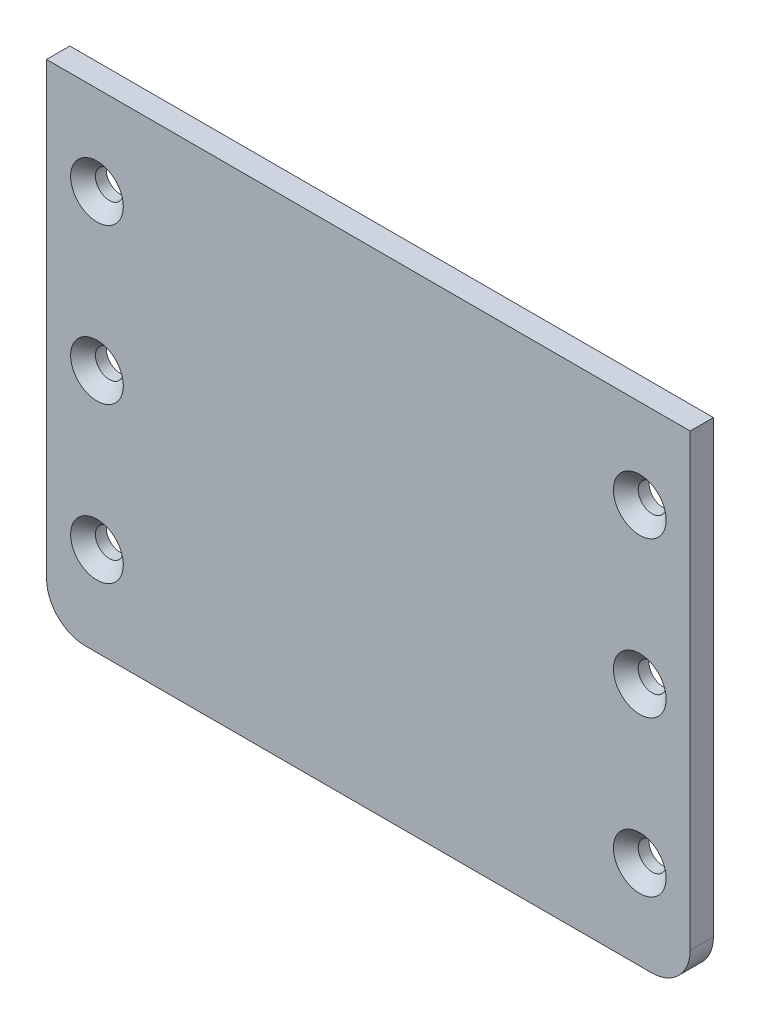
ISO-10303-21;
HEADER;
FILE_DESCRIPTION(('STEP AP214'),'2;1');
FILE_NAME('part.step','',(''),(''),'','','');
FILE_SCHEMA(('AUTOMOTIVE_DESIGN { 1 0 10303 214 1 1 1 1 }'));
ENDSEC;
DATA;
#1=APPLICATION_CONTEXT('core data for automotive mechanical design processes');
#2=APPLICATION_PROTOCOL_DEFINITION('international standard','automotive_design',2000,#1);
#3=PRODUCT_CONTEXT('',#1,'mechanical');
#4=PRODUCT('Part','Part','',(#3));
#5=PRODUCT_RELATED_PRODUCT_CATEGORY('part','',(#4));
#6=PRODUCT_DEFINITION_FORMATION('','',#4);
#7=PRODUCT_DEFINITION_CONTEXT('part definition',#1,'design');
#8=PRODUCT_DEFINITION('design','',#6,#7);
#9=PRODUCT_DEFINITION_SHAPE('','',#8);
#10=(LENGTH_UNIT() NAMED_UNIT(*) SI_UNIT(.MILLI.,.METRE.));
#11=(NAMED_UNIT(*) PLANE_ANGLE_UNIT() SI_UNIT($,.RADIAN.));
#12=(NAMED_UNIT(*) SI_UNIT($,.STERADIAN.) SOLID_ANGLE_UNIT());
#13=UNCERTAINTY_MEASURE_WITH_UNIT(LENGTH_MEASURE(1.E-05),#10,'distance_accuracy_value','');
#14=(GEOMETRIC_REPRESENTATION_CONTEXT(3) GLOBAL_UNCERTAINTY_ASSIGNED_CONTEXT((#13)) GLOBAL_UNIT_ASSIGNED_CONTEXT((#10,
#11,#12)) REPRESENTATION_CONTEXT('',''));
#15=CARTESIAN_POINT('',(0.,0.,0.));
#16=DIRECTION('',(0.,0.,1.));
#17=DIRECTION('',(1.,0.,0.));
#18=AXIS2_PLACEMENT_3D('',#15,#16,#17);
#19=CARTESIAN_POINT('',(-72.,0.,3.));
#20=DIRECTION('',(-1.,0.,0.));
#21=DIRECTION('',(0.,0.,1.));
#22=AXIS2_PLACEMENT_3D('',#19,#20,#21);
#23=PLANE('',#22);
#24=DIRECTION('',(0.,1.,0.));
#25=VECTOR('',#24,1.);
#26=CARTESIAN_POINT('',(-72.,0.,0.));
#27=LINE('',#26,#25);
#28=CARTESIAN_POINT('',(-72.,4.99999999999999,0.));
#29=VERTEX_POINT('',#28);
#30=CARTESIAN_POINT('',(-72.,63.,0.));
#31=VERTEX_POINT('',#30);
#32=EDGE_CURVE('E122',#29,#31,#27,.T.);
#33=ORIENTED_EDGE('',*,*,#32,.F.);
#34=DIRECTION('',(0.,0.,-1.));
#35=VECTOR('',#34,1.);
#36=CARTESIAN_POINT('',(-72.,4.99999999999999,3.));
#37=LINE('',#36,#35);
#38=CARTESIAN_POINT('',(-72.,4.99999999999999,3.));
#39=VERTEX_POINT('',#38);
#40=EDGE_CURVE('E65',#29,#39,#37,.F.);
#41=ORIENTED_EDGE('',*,*,#40,.T.);
#42=DIRECTION('',(0.,1.,0.));
#43=VECTOR('',#42,1.);
#44=CARTESIAN_POINT('',(-72.,0.,3.));
#45=LINE('',#44,#43);
#46=CARTESIAN_POINT('',(-72.,63.,3.));
#47=VERTEX_POINT('',#46);
#48=EDGE_CURVE('E130',#39,#47,#45,.T.);
#49=ORIENTED_EDGE('',*,*,#48,.T.);
#50=DIRECTION('',(0.,0.,-1.));
#51=VECTOR('',#50,1.);
#52=CARTESIAN_POINT('',(-72.,63.,3.));
#53=LINE('',#52,#51);
#54=EDGE_CURVE('E114',#47,#31,#53,.T.);
#55=ORIENTED_EDGE('',*,*,#54,.T.);
#56=EDGE_LOOP('',(#33,#41,#49,#55));
#57=FACE_BOUND('',#56,.T.);
#58=ADVANCED_FACE('F42',(#57),#23,.T.);
#59=CARTESIAN_POINT('',(0.,0.,3.));
#60=DIRECTION('',(0.,-1.,0.));
#61=DIRECTION('',(1.,0.,0.));
#62=AXIS2_PLACEMENT_3D('',#59,#60,#61);
#63=PLANE('',#62);
#64=DIRECTION('',(-1.,0.,0.));
#65=VECTOR('',#64,1.);
#66=CARTESIAN_POINT('',(0.,0.,3.));
#67=LINE('',#66,#65);
#68=CARTESIAN_POINT('',(6.,0.,3.));
#69=VERTEX_POINT('',#68);
#70=CARTESIAN_POINT('',(-67.,0.,3.));
#71=VERTEX_POINT('',#70);
#72=EDGE_CURVE('E103',#69,#71,#67,.T.);
#73=ORIENTED_EDGE('',*,*,#72,.T.);
#74=DIRECTION('',(0.,0.,-1.));
#75=VECTOR('',#74,1.);
#76=CARTESIAN_POINT('',(-67.,0.,3.));
#77=LINE('',#76,#75);
#78=CARTESIAN_POINT('',(-67.,0.,0.));
#79=VERTEX_POINT('',#78);
#80=EDGE_CURVE('E161',#71,#79,#77,.T.);
#81=ORIENTED_EDGE('',*,*,#80,.T.);
#82=DIRECTION('',(-1.,0.,0.));
#83=VECTOR('',#82,1.);
#84=CARTESIAN_POINT('',(0.,0.,0.));
#85=LINE('',#84,#83);
#86=CARTESIAN_POINT('',(6.,0.,0.));
#87=VERTEX_POINT('',#86);
#88=EDGE_CURVE('E124',#87,#79,#85,.T.);
#89=ORIENTED_EDGE('',*,*,#88,.F.);
#90=DIRECTION('',(0.,0.,-1.));
#91=VECTOR('',#90,1.);
#92=CARTESIAN_POINT('',(6.,0.,3.));
#93=LINE('',#92,#91);
#94=EDGE_CURVE('E113',#87,#69,#93,.F.);
#95=ORIENTED_EDGE('',*,*,#94,.T.);
#96=EDGE_LOOP('',(#73,#81,#89,#95));
#97=FACE_BOUND('',#96,.T.);
#98=ADVANCED_FACE('F174',(#97),#63,.T.);
#99=CARTESIAN_POINT('',(11.,0.,3.));
#100=DIRECTION('',(-1.,0.,0.));
#101=DIRECTION('',(0.,-1.,0.));
#102=AXIS2_PLACEMENT_3D('',#99,#100,#101);
#103=PLANE('',#102);
#104=DIRECTION('',(0.,1.,0.));
#105=VECTOR('',#104,1.);
#106=CARTESIAN_POINT('',(11.,0.,3.));
#107=LINE('',#106,#105);
#108=CARTESIAN_POINT('',(11.,5.,3.));
#109=VERTEX_POINT('',#108);
#110=CARTESIAN_POINT('',(11.,63.,3.));
#111=VERTEX_POINT('',#110);
#112=EDGE_CURVE('E95',#109,#111,#107,.T.);
#113=ORIENTED_EDGE('',*,*,#112,.F.);
#114=DIRECTION('',(0.,0.,-1.));
#115=VECTOR('',#114,1.);
#116=CARTESIAN_POINT('',(11.,5.,0.));
#117=LINE('',#116,#115);
#118=CARTESIAN_POINT('',(11.,5.,0.));
#119=VERTEX_POINT('',#118);
#120=EDGE_CURVE('E11',#109,#119,#117,.T.);
#121=ORIENTED_EDGE('',*,*,#120,.T.);
#122=DIRECTION('',(0.,1.,0.));
#123=VECTOR('',#122,1.);
#124=CARTESIAN_POINT('',(11.,0.,0.));
#125=LINE('',#124,#123);
#126=CARTESIAN_POINT('',(11.,63.,0.));
#127=VERTEX_POINT('',#126);
#128=EDGE_CURVE('E109',#119,#127,#125,.T.);
#129=ORIENTED_EDGE('',*,*,#128,.T.);
#130=DIRECTION('',(0.,0.,-1.));
#131=VECTOR('',#130,1.);
#132=CARTESIAN_POINT('',(11.,63.,3.));
#133=LINE('',#132,#131);
#134=EDGE_CURVE('E106',#111,#127,#133,.T.);
#135=ORIENTED_EDGE('',*,*,#134,.F.);
#136=EDGE_LOOP('',(#113,#121,#129,#135));
#137=FACE_BOUND('',#136,.T.);
#138=ADVANCED_FACE('F107',(#137),#103,.F.);
#139=CARTESIAN_POINT('',(0.,63.,3.));
#140=DIRECTION('',(0.,-1.,0.));
#141=DIRECTION('',(0.,0.,-1.));
#142=AXIS2_PLACEMENT_3D('',#139,#140,#141);
#143=PLANE('',#142);
#144=DIRECTION('',(-1.,0.,0.));
#145=VECTOR('',#144,1.);
#146=CARTESIAN_POINT('',(0.,63.,0.));
#147=LINE('',#146,#145);
#148=EDGE_CURVE('E129',#127,#31,#147,.T.);
#149=ORIENTED_EDGE('',*,*,#148,.T.);
#150=ORIENTED_EDGE('',*,*,#54,.F.);
#151=DIRECTION('',(-1.,0.,0.));
#152=VECTOR('',#151,1.);
#153=CARTESIAN_POINT('',(0.,63.,3.));
#154=LINE('',#153,#152);
#155=EDGE_CURVE('E99',#111,#47,#154,.T.);
#156=ORIENTED_EDGE('',*,*,#155,.F.);
#157=ORIENTED_EDGE('',*,*,#134,.T.);
#158=EDGE_LOOP('',(#149,#150,#156,#157));
#159=FACE_BOUND('',#158,.T.);
#160=ADVANCED_FACE('F116',(#159),#143,.F.);
#161=CARTESIAN_POINT('',(0.,0.,3.));
#162=DIRECTION('',(0.,0.,1.));
#163=DIRECTION('',(1.,0.,0.));
#164=AXIS2_PLACEMENT_3D('',#161,#162,#163);
#165=PLANE('',#164);
#166=CARTESIAN_POINT('',(-65.5,31.5,3.));
#167=DIRECTION('',(0.,0.,1.));
#168=DIRECTION('',(1.,0.,0.));
#169=AXIS2_PLACEMENT_3D('',#166,#167,#168);
#170=CIRCLE('',#169,3.4);
#171=CARTESIAN_POINT('',(-62.1,31.5,3.));
#172=VERTEX_POINT('',#171);
#173=EDGE_CURVE('E256',#172,#172,#170,.T.);
#174=ORIENTED_EDGE('',*,*,#173,.F.);
#175=EDGE_LOOP('',(#174));
#176=FACE_BOUND('',#175,.T.);
#177=CARTESIAN_POINT('',(-65.5,51.5,3.));
#178=DIRECTION('',(0.,0.,1.));
#179=DIRECTION('',(1.,0.,0.));
#180=AXIS2_PLACEMENT_3D('',#177,#178,#179);
#181=CIRCLE('',#180,3.4);
#182=CARTESIAN_POINT('',(-62.1,51.5,3.));
#183=VERTEX_POINT('',#182);
#184=EDGE_CURVE('E158',#183,#183,#181,.T.);
#185=ORIENTED_EDGE('',*,*,#184,.F.);
#186=EDGE_LOOP('',(#185));
#187=FACE_BOUND('',#186,.T.);
#188=CARTESIAN_POINT('',(-65.5,11.5,3.));
#189=DIRECTION('',(0.,0.,1.));
#190=DIRECTION('',(1.,0.,0.));
#191=AXIS2_PLACEMENT_3D('',#188,#189,#190);
#192=CIRCLE('',#191,3.4);
#193=CARTESIAN_POINT('',(-62.1,11.5,3.));
#194=VERTEX_POINT('',#193);
#195=EDGE_CURVE('E153',#194,#194,#192,.T.);
#196=ORIENTED_EDGE('',*,*,#195,.F.);
#197=EDGE_LOOP('',(#196));
#198=FACE_BOUND('',#197,.T.);
#199=CARTESIAN_POINT('',(4.5,11.5,3.));
#200=DIRECTION('',(0.,0.,1.));
#201=DIRECTION('',(1.,0.,0.));
#202=AXIS2_PLACEMENT_3D('',#199,#200,#201);
#203=CIRCLE('',#202,3.4);
#204=CARTESIAN_POINT('',(7.9,11.5,3.));
#205=VERTEX_POINT('',#204);
#206=EDGE_CURVE('E148',#205,#205,#203,.T.);
#207=ORIENTED_EDGE('',*,*,#206,.F.);
#208=EDGE_LOOP('',(#207));
#209=FACE_BOUND('',#208,.T.);
#210=CARTESIAN_POINT('',(4.5,31.5,3.));
#211=DIRECTION('',(0.,0.,1.));
#212=DIRECTION('',(1.,0.,0.));
#213=AXIS2_PLACEMENT_3D('',#210,#211,#212);
#214=CIRCLE('',#213,3.4);
#215=CARTESIAN_POINT('',(7.9,31.5,3.));
#216=VERTEX_POINT('',#215);
#217=EDGE_CURVE('E143',#216,#216,#214,.T.);
#218=ORIENTED_EDGE('',*,*,#217,.F.);
#219=EDGE_LOOP('',(#218));
#220=FACE_BOUND('',#219,.T.);
#221=CARTESIAN_POINT('',(4.5,51.5,3.));
#222=DIRECTION('',(0.,0.,1.));
#223=DIRECTION('',(1.,0.,0.));
#224=AXIS2_PLACEMENT_3D('',#221,#222,#223);
#225=CIRCLE('',#224,3.4);
#226=CARTESIAN_POINT('',(7.9,51.5,3.));
#227=VERTEX_POINT('',#226);
#228=EDGE_CURVE('E138',#227,#227,#225,.T.);
#229=ORIENTED_EDGE('',*,*,#228,.F.);
#230=EDGE_LOOP('',(#229));
#231=FACE_BOUND('',#230,.T.);
#232=ORIENTED_EDGE('',*,*,#48,.F.);
#233=CARTESIAN_POINT('',(-67.,4.99999999999999,3.));
#234=DIRECTION('',(0.,0.,1.));
#235=DIRECTION('',(1.,0.,0.));
#236=AXIS2_PLACEMENT_3D('',#233,#234,#235);
#237=CIRCLE('',#236,5.);
#238=EDGE_CURVE('E50',#39,#71,#237,.T.);
#239=ORIENTED_EDGE('',*,*,#238,.T.);
#240=ORIENTED_EDGE('',*,*,#72,.F.);
#241=CARTESIAN_POINT('',(6.,5.,3.));
#242=DIRECTION('',(0.,0.,1.));
#243=DIRECTION('',(1.,0.,0.));
#244=AXIS2_PLACEMENT_3D('',#241,#242,#243);
#245=CIRCLE('',#244,5.);
#246=EDGE_CURVE('E57',#69,#109,#245,.T.);
#247=ORIENTED_EDGE('',*,*,#246,.T.);
#248=ORIENTED_EDGE('',*,*,#112,.T.);
#249=ORIENTED_EDGE('',*,*,#155,.T.);
#250=EDGE_LOOP('',(#232,#239,#240,#247,#248,#249));
#251=FACE_BOUND('',#250,.T.);
#252=ADVANCED_FACE('F97',(#176,#187,#198,#209,#220,#231,#251),#165,.T.);
#253=CARTESIAN_POINT('',(0.,0.,0.));
#254=DIRECTION('',(0.,0.,1.));
#255=DIRECTION('',(1.,0.,0.));
#256=AXIS2_PLACEMENT_3D('',#253,#254,#255);
#257=PLANE('',#256);
#258=CARTESIAN_POINT('',(-65.5,31.5,0.));
#259=DIRECTION('',(0.,0.,1.));
#260=DIRECTION('',(1.,0.,0.));
#261=AXIS2_PLACEMENT_3D('',#258,#259,#260);
#262=CIRCLE('',#261,1.8);
#263=CARTESIAN_POINT('',(-63.7,31.5,0.));
#264=VERTEX_POINT('',#263);
#265=EDGE_CURVE('E155',#264,#264,#262,.T.);
#266=ORIENTED_EDGE('',*,*,#265,.T.);
#267=EDGE_LOOP('',(#266));
#268=FACE_BOUND('',#267,.T.);
#269=CARTESIAN_POINT('',(-65.5,51.5,0.));
#270=DIRECTION('',(0.,0.,1.));
#271=DIRECTION('',(1.,0.,0.));
#272=AXIS2_PLACEMENT_3D('',#269,#270,#271);
#273=CIRCLE('',#272,1.8);
#274=CARTESIAN_POINT('',(-63.7,51.5,0.));
#275=VERTEX_POINT('',#274);
#276=EDGE_CURVE('E150',#275,#275,#273,.T.);
#277=ORIENTED_EDGE('',*,*,#276,.T.);
#278=EDGE_LOOP('',(#277));
#279=FACE_BOUND('',#278,.T.);
#280=CARTESIAN_POINT('',(-65.5,11.5,0.));
#281=DIRECTION('',(0.,0.,1.));
#282=DIRECTION('',(1.,0.,0.));
#283=AXIS2_PLACEMENT_3D('',#280,#281,#282);
#284=CIRCLE('',#283,1.8);
#285=CARTESIAN_POINT('',(-63.7,11.5,0.));
#286=VERTEX_POINT('',#285);
#287=EDGE_CURVE('E145',#286,#286,#284,.T.);
#288=ORIENTED_EDGE('',*,*,#287,.T.);
#289=EDGE_LOOP('',(#288));
#290=FACE_BOUND('',#289,.T.);
#291=CARTESIAN_POINT('',(4.5,11.5,0.));
#292=DIRECTION('',(0.,0.,1.));
#293=DIRECTION('',(1.,0.,0.));
#294=AXIS2_PLACEMENT_3D('',#291,#292,#293);
#295=CIRCLE('',#294,1.8);
#296=CARTESIAN_POINT('',(6.3,11.5,0.));
#297=VERTEX_POINT('',#296);
#298=EDGE_CURVE('E140',#297,#297,#295,.T.);
#299=ORIENTED_EDGE('',*,*,#298,.T.);
#300=EDGE_LOOP('',(#299));
#301=FACE_BOUND('',#300,.T.);
#302=CARTESIAN_POINT('',(4.5,31.5,0.));
#303=DIRECTION('',(0.,0.,1.));
#304=DIRECTION('',(1.,0.,0.));
#305=AXIS2_PLACEMENT_3D('',#302,#303,#304);
#306=CIRCLE('',#305,1.8);
#307=CARTESIAN_POINT('',(6.3,31.5,0.));
#308=VERTEX_POINT('',#307);
#309=EDGE_CURVE('E135',#308,#308,#306,.T.);
#310=ORIENTED_EDGE('',*,*,#309,.T.);
#311=EDGE_LOOP('',(#310));
#312=FACE_BOUND('',#311,.T.);
#313=CARTESIAN_POINT('',(4.5,51.5,0.));
#314=DIRECTION('',(0.,0.,1.));
#315=DIRECTION('',(1.,0.,0.));
#316=AXIS2_PLACEMENT_3D('',#313,#314,#315);
#317=CIRCLE('',#316,1.8);
#318=CARTESIAN_POINT('',(6.3,51.5,0.));
#319=VERTEX_POINT('',#318);
#320=EDGE_CURVE('E125',#319,#319,#317,.T.);
#321=ORIENTED_EDGE('',*,*,#320,.T.);
#322=EDGE_LOOP('',(#321));
#323=FACE_BOUND('',#322,.T.);
#324=ORIENTED_EDGE('',*,*,#88,.T.);
#325=CARTESIAN_POINT('',(-67.,4.99999999999999,0.));
#326=DIRECTION('',(0.,0.,1.));
#327=DIRECTION('',(1.,0.,0.));
#328=AXIS2_PLACEMENT_3D('',#325,#326,#327);
#329=CIRCLE('',#328,5.);
#330=EDGE_CURVE('E166',#79,#29,#329,.F.);
#331=ORIENTED_EDGE('',*,*,#330,.T.);
#332=ORIENTED_EDGE('',*,*,#32,.T.);
#333=ORIENTED_EDGE('',*,*,#148,.F.);
#334=ORIENTED_EDGE('',*,*,#128,.F.);
#335=CARTESIAN_POINT('',(6.,5.,0.));
#336=DIRECTION('',(0.,0.,1.));
#337=DIRECTION('',(1.,0.,0.));
#338=AXIS2_PLACEMENT_3D('',#335,#336,#337);
#339=CIRCLE('',#338,5.);
#340=EDGE_CURVE('E164',#119,#87,#339,.F.);
#341=ORIENTED_EDGE('',*,*,#340,.T.);
#342=EDGE_LOOP('',(#324,#331,#332,#333,#334,#341));
#343=FACE_BOUND('',#342,.T.);
#344=ADVANCED_FACE('F179',(#268,#279,#290,#301,#312,#323,#343),#257,.F.);
#345=CARTESIAN_POINT('',(4.5,51.5,3.));
#346=DIRECTION('',(0.,0.,1.));
#347=DIRECTION('',(1.,0.,0.));
#348=AXIS2_PLACEMENT_3D('',#345,#346,#347);
#349=CYLINDRICAL_SURFACE('',#348,1.8);
#350=CARTESIAN_POINT('',(4.5,51.5,1.4));
#351=DIRECTION('',(0.,0.,1.));
#352=DIRECTION('',(1.,0.,0.));
#353=AXIS2_PLACEMENT_3D('',#350,#351,#352);
#354=CIRCLE('',#353,1.8);
#355=CARTESIAN_POINT('',(6.3,51.5,1.4));
#356=VERTEX_POINT('',#355);
#357=EDGE_CURVE('E134',#356,#356,#354,.T.);
#358=ORIENTED_EDGE('',*,*,#357,.T.);
#359=EDGE_LOOP('',(#358));
#360=FACE_BOUND('',#359,.T.);
#361=ORIENTED_EDGE('',*,*,#320,.F.);
#362=EDGE_LOOP('',(#361));
#363=FACE_BOUND('',#362,.T.);
#364=ADVANCED_FACE('F199',(#360,#363),#349,.F.);
#365=CARTESIAN_POINT('',(4.5,51.5,3.));
#366=DIRECTION('',(0.,0.,1.));
#367=DIRECTION('',(1.,0.,0.));
#368=AXIS2_PLACEMENT_3D('',#365,#366,#367);
#369=CONICAL_SURFACE('',#368,3.4,0.785398163397449);
#370=ORIENTED_EDGE('',*,*,#357,.F.);
#371=EDGE_LOOP('',(#370));
#372=FACE_BOUND('',#371,.T.);
#373=ORIENTED_EDGE('',*,*,#228,.T.);
#374=EDGE_LOOP('',(#373));
#375=FACE_BOUND('',#374,.T.);
#376=ADVANCED_FACE('F206',(#372,#375),#369,.F.);
#377=CARTESIAN_POINT('',(4.5,31.5,3.));
#378=DIRECTION('',(0.,0.,1.));
#379=DIRECTION('',(1.,0.,0.));
#380=AXIS2_PLACEMENT_3D('',#377,#378,#379);
#381=CYLINDRICAL_SURFACE('',#380,1.8);
#382=CARTESIAN_POINT('',(4.5,31.5,1.4));
#383=DIRECTION('',(0.,0.,1.));
#384=DIRECTION('',(1.,0.,0.));
#385=AXIS2_PLACEMENT_3D('',#382,#383,#384);
#386=CIRCLE('',#385,1.8);
#387=CARTESIAN_POINT('',(6.3,31.5,1.4));
#388=VERTEX_POINT('',#387);
#389=EDGE_CURVE('E139',#388,#388,#386,.T.);
#390=ORIENTED_EDGE('',*,*,#389,.T.);
#391=EDGE_LOOP('',(#390));
#392=FACE_BOUND('',#391,.T.);
#393=ORIENTED_EDGE('',*,*,#309,.F.);
#394=EDGE_LOOP('',(#393));
#395=FACE_BOUND('',#394,.T.);
#396=ADVANCED_FACE('F210',(#392,#395),#381,.F.);
#397=CARTESIAN_POINT('',(4.5,31.5,3.));
#398=DIRECTION('',(0.,0.,1.));
#399=DIRECTION('',(1.,0.,0.));
#400=AXIS2_PLACEMENT_3D('',#397,#398,#399);
#401=CONICAL_SURFACE('',#400,3.4,0.785398163397449);
#402=ORIENTED_EDGE('',*,*,#389,.F.);
#403=EDGE_LOOP('',(#402));
#404=FACE_BOUND('',#403,.T.);
#405=ORIENTED_EDGE('',*,*,#217,.T.);
#406=EDGE_LOOP('',(#405));
#407=FACE_BOUND('',#406,.T.);
#408=ADVANCED_FACE('F214',(#404,#407),#401,.F.);
#409=CARTESIAN_POINT('',(4.5,11.5,3.));
#410=DIRECTION('',(0.,0.,1.));
#411=DIRECTION('',(1.,0.,0.));
#412=AXIS2_PLACEMENT_3D('',#409,#410,#411);
#413=CYLINDRICAL_SURFACE('',#412,1.8);
#414=CARTESIAN_POINT('',(4.5,11.5,1.4));
#415=DIRECTION('',(0.,0.,1.));
#416=DIRECTION('',(1.,0.,0.));
#417=AXIS2_PLACEMENT_3D('',#414,#415,#416);
#418=CIRCLE('',#417,1.8);
#419=CARTESIAN_POINT('',(6.3,11.5,1.4));
#420=VERTEX_POINT('',#419);
#421=EDGE_CURVE('E144',#420,#420,#418,.T.);
#422=ORIENTED_EDGE('',*,*,#421,.T.);
#423=EDGE_LOOP('',(#422));
#424=FACE_BOUND('',#423,.T.);
#425=ORIENTED_EDGE('',*,*,#298,.F.);
#426=EDGE_LOOP('',(#425));
#427=FACE_BOUND('',#426,.T.);
#428=ADVANCED_FACE('F218',(#424,#427),#413,.F.);
#429=CARTESIAN_POINT('',(4.5,11.5,3.));
#430=DIRECTION('',(0.,0.,1.));
#431=DIRECTION('',(1.,0.,0.));
#432=AXIS2_PLACEMENT_3D('',#429,#430,#431);
#433=CONICAL_SURFACE('',#432,3.4,0.785398163397449);
#434=ORIENTED_EDGE('',*,*,#421,.F.);
#435=EDGE_LOOP('',(#434));
#436=FACE_BOUND('',#435,.T.);
#437=ORIENTED_EDGE('',*,*,#206,.T.);
#438=EDGE_LOOP('',(#437));
#439=FACE_BOUND('',#438,.T.);
#440=ADVANCED_FACE('F222',(#436,#439),#433,.F.);
#441=CARTESIAN_POINT('',(-65.5,11.5,3.));
#442=DIRECTION('',(0.,0.,1.));
#443=DIRECTION('',(1.,0.,0.));
#444=AXIS2_PLACEMENT_3D('',#441,#442,#443);
#445=CYLINDRICAL_SURFACE('',#444,1.8);
#446=CARTESIAN_POINT('',(-65.5,11.5,1.4));
#447=DIRECTION('',(0.,0.,1.));
#448=DIRECTION('',(1.,0.,0.));
#449=AXIS2_PLACEMENT_3D('',#446,#447,#448);
#450=CIRCLE('',#449,1.8);
#451=CARTESIAN_POINT('',(-63.7,11.5,1.4));
#452=VERTEX_POINT('',#451);
#453=EDGE_CURVE('E149',#452,#452,#450,.T.);
#454=ORIENTED_EDGE('',*,*,#453,.T.);
#455=EDGE_LOOP('',(#454));
#456=FACE_BOUND('',#455,.T.);
#457=ORIENTED_EDGE('',*,*,#287,.F.);
#458=EDGE_LOOP('',(#457));
#459=FACE_BOUND('',#458,.T.);
#460=ADVANCED_FACE('F226',(#456,#459),#445,.F.);
#461=CARTESIAN_POINT('',(-65.5,11.5,3.));
#462=DIRECTION('',(0.,0.,1.));
#463=DIRECTION('',(1.,0.,0.));
#464=AXIS2_PLACEMENT_3D('',#461,#462,#463);
#465=CONICAL_SURFACE('',#464,3.4,0.78539816339745);
#466=ORIENTED_EDGE('',*,*,#453,.F.);
#467=EDGE_LOOP('',(#466));
#468=FACE_BOUND('',#467,.T.);
#469=ORIENTED_EDGE('',*,*,#195,.T.);
#470=EDGE_LOOP('',(#469));
#471=FACE_BOUND('',#470,.T.);
#472=ADVANCED_FACE('F230',(#468,#471),#465,.F.);
#473=CARTESIAN_POINT('',(-65.5,51.5,3.));
#474=DIRECTION('',(0.,0.,1.));
#475=DIRECTION('',(1.,0.,0.));
#476=AXIS2_PLACEMENT_3D('',#473,#474,#475);
#477=CYLINDRICAL_SURFACE('',#476,1.8);
#478=CARTESIAN_POINT('',(-65.5,51.5,1.4));
#479=DIRECTION('',(0.,0.,1.));
#480=DIRECTION('',(1.,0.,0.));
#481=AXIS2_PLACEMENT_3D('',#478,#479,#480);
#482=CIRCLE('',#481,1.8);
#483=CARTESIAN_POINT('',(-63.7,51.5,1.4));
#484=VERTEX_POINT('',#483);
#485=EDGE_CURVE('E154',#484,#484,#482,.T.);
#486=ORIENTED_EDGE('',*,*,#485,.T.);
#487=EDGE_LOOP('',(#486));
#488=FACE_BOUND('',#487,.T.);
#489=ORIENTED_EDGE('',*,*,#276,.F.);
#490=EDGE_LOOP('',(#489));
#491=FACE_BOUND('',#490,.T.);
#492=ADVANCED_FACE('F234',(#488,#491),#477,.F.);
#493=CARTESIAN_POINT('',(-65.5,51.5,3.));
#494=DIRECTION('',(0.,0.,1.));
#495=DIRECTION('',(1.,0.,0.));
#496=AXIS2_PLACEMENT_3D('',#493,#494,#495);
#497=CONICAL_SURFACE('',#496,3.4,0.78539816339745);
#498=ORIENTED_EDGE('',*,*,#485,.F.);
#499=EDGE_LOOP('',(#498));
#500=FACE_BOUND('',#499,.T.);
#501=ORIENTED_EDGE('',*,*,#184,.T.);
#502=EDGE_LOOP('',(#501));
#503=FACE_BOUND('',#502,.T.);
#504=ADVANCED_FACE('F238',(#500,#503),#497,.F.);
#505=CARTESIAN_POINT('',(-65.5,31.5,3.));
#506=DIRECTION('',(0.,0.,1.));
#507=DIRECTION('',(1.,0.,0.));
#508=AXIS2_PLACEMENT_3D('',#505,#506,#507);
#509=CYLINDRICAL_SURFACE('',#508,1.8);
#510=CARTESIAN_POINT('',(-65.5,31.5,1.4));
#511=DIRECTION('',(0.,0.,1.));
#512=DIRECTION('',(1.,0.,0.));
#513=AXIS2_PLACEMENT_3D('',#510,#511,#512);
#514=CIRCLE('',#513,1.8);
#515=CARTESIAN_POINT('',(-63.7,31.5,1.4));
#516=VERTEX_POINT('',#515);
#517=EDGE_CURVE('E159',#516,#516,#514,.T.);
#518=ORIENTED_EDGE('',*,*,#517,.T.);
#519=EDGE_LOOP('',(#518));
#520=FACE_BOUND('',#519,.T.);
#521=ORIENTED_EDGE('',*,*,#265,.F.);
#522=EDGE_LOOP('',(#521));
#523=FACE_BOUND('',#522,.T.);
#524=ADVANCED_FACE('F242',(#520,#523),#509,.F.);
#525=CARTESIAN_POINT('',(-65.5,31.5,3.));
#526=DIRECTION('',(0.,0.,1.));
#527=DIRECTION('',(1.,0.,0.));
#528=AXIS2_PLACEMENT_3D('',#525,#526,#527);
#529=CONICAL_SURFACE('',#528,3.4,0.78539816339745);
#530=ORIENTED_EDGE('',*,*,#517,.F.);
#531=EDGE_LOOP('',(#530));
#532=FACE_BOUND('',#531,.T.);
#533=ORIENTED_EDGE('',*,*,#173,.T.);
#534=EDGE_LOOP('',(#533));
#535=FACE_BOUND('',#534,.T.);
#536=ADVANCED_FACE('F185',(#532,#535),#529,.F.);
#537=CARTESIAN_POINT('',(-67.,4.99999999999999,3.));
#538=DIRECTION('',(0.,0.,-1.));
#539=DIRECTION('',(-1.,0.,0.));
#540=AXIS2_PLACEMENT_3D('',#537,#538,#539);
#541=CYLINDRICAL_SURFACE('',#540,5.);
#542=ORIENTED_EDGE('',*,*,#238,.F.);
#543=ORIENTED_EDGE('',*,*,#40,.F.);
#544=ORIENTED_EDGE('',*,*,#330,.F.);
#545=ORIENTED_EDGE('',*,*,#80,.F.);
#546=EDGE_LOOP('',(#542,#543,#544,#545));
#547=FACE_BOUND('',#546,.T.);
#548=ADVANCED_FACE('F177',(#547),#541,.T.);
#549=CARTESIAN_POINT('',(6.,5.,3.));
#550=DIRECTION('',(0.,0.,1.));
#551=DIRECTION('',(1.,0.,0.));
#552=AXIS2_PLACEMENT_3D('',#549,#550,#551);
#553=CYLINDRICAL_SURFACE('',#552,5.);
#554=ORIENTED_EDGE('',*,*,#246,.F.);
#555=ORIENTED_EDGE('',*,*,#94,.F.);
#556=ORIENTED_EDGE('',*,*,#340,.F.);
#557=ORIENTED_EDGE('',*,*,#120,.F.);
#558=EDGE_LOOP('',(#554,#555,#556,#557));
#559=FACE_BOUND('',#558,.T.);
#560=ADVANCED_FACE('F44',(#559),#553,.T.);
#561=CLOSED_SHELL('',(#58,#98,#138,#160,#252,#344,#364,#376,#396,#408,#428,#440,#460,#472,#492,
#504,#524,#536,#548,#560));
#562=MANIFOLD_SOLID_BREP('B2',#561);
#563=ADVANCED_BREP_SHAPE_REPRESENTATION('',(#18,#562),#14);
#564=SHAPE_DEFINITION_REPRESENTATION(#9,#563);
ENDSEC;
END-ISO-10303-21;
